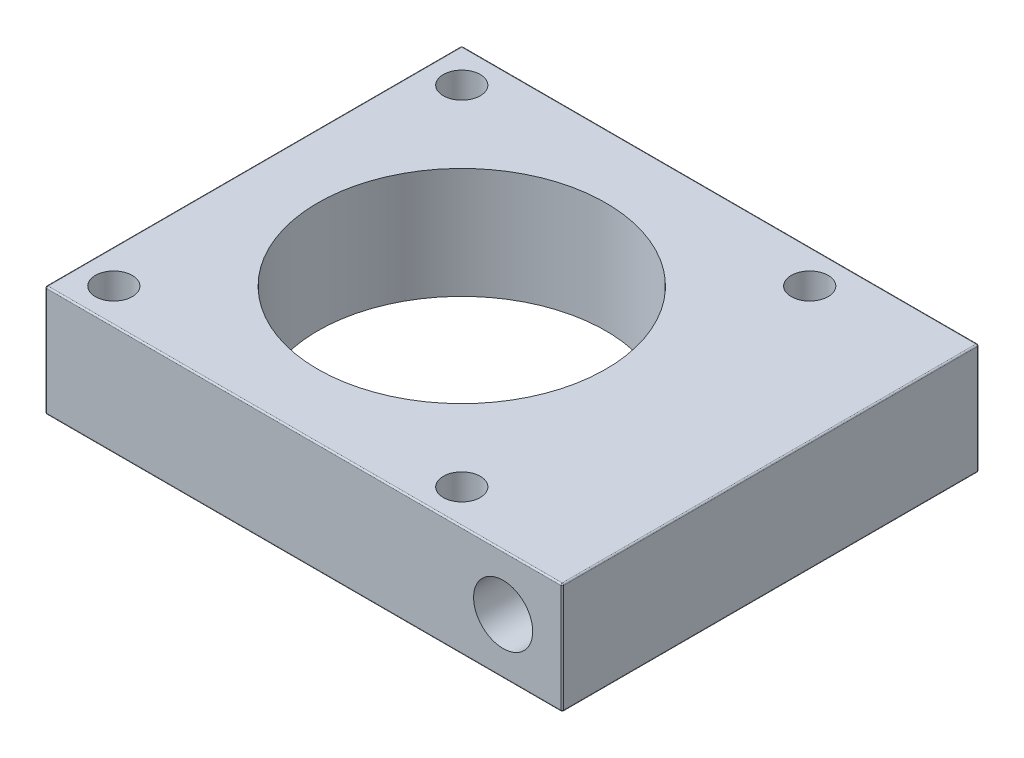
ISO-10303-21;
HEADER;
FILE_DESCRIPTION(('STEP AP214'),'2;1');
FILE_NAME('part.step','',(''),(''),'','','');
FILE_SCHEMA(('AUTOMOTIVE_DESIGN { 1 0 10303 214 1 1 1 1 }'));
ENDSEC;
DATA;
#1=APPLICATION_CONTEXT('core data for automotive mechanical design processes');
#2=APPLICATION_PROTOCOL_DEFINITION('international standard','automotive_design',2000,#1);
#3=PRODUCT_CONTEXT('',#1,'mechanical');
#4=PRODUCT('Part','Part','',(#3));
#5=PRODUCT_RELATED_PRODUCT_CATEGORY('part','',(#4));
#6=PRODUCT_DEFINITION_FORMATION('','',#4);
#7=PRODUCT_DEFINITION_CONTEXT('part definition',#1,'design');
#8=PRODUCT_DEFINITION('design','',#6,#7);
#9=PRODUCT_DEFINITION_SHAPE('','',#8);
#10=(LENGTH_UNIT() NAMED_UNIT(*) SI_UNIT(.MILLI.,.METRE.));
#11=(NAMED_UNIT(*) PLANE_ANGLE_UNIT() SI_UNIT($,.RADIAN.));
#12=(NAMED_UNIT(*) SI_UNIT($,.STERADIAN.) SOLID_ANGLE_UNIT());
#13=UNCERTAINTY_MEASURE_WITH_UNIT(LENGTH_MEASURE(1.E-05),#10,'distance_accuracy_value','');
#14=(GEOMETRIC_REPRESENTATION_CONTEXT(3) GLOBAL_UNCERTAINTY_ASSIGNED_CONTEXT((#13)) GLOBAL_UNIT_ASSIGNED_CONTEXT((#10,
#11,#12)) REPRESENTATION_CONTEXT('',''));
#15=CARTESIAN_POINT('',(0.,0.,0.));
#16=DIRECTION('',(0.,0.,1.));
#17=DIRECTION('',(1.,0.,0.));
#18=AXIS2_PLACEMENT_3D('',#15,#16,#17);
#19=CARTESIAN_POINT('',(0.,0.,56.4));
#20=DIRECTION('',(0.,0.,-1.));
#21=DIRECTION('',(-1.,0.,0.));
#22=AXIS2_PLACEMENT_3D('',#19,#20,#21);
#23=PLANE('',#22);
#24=DIRECTION('',(0.,-1.,0.));
#25=VECTOR('',#24,1.);
#26=CARTESIAN_POINT('',(0.2,0.,56.4));
#27=LINE('',#26,#25);
#28=CARTESIAN_POINT('',(0.2,14.8,56.4));
#29=VERTEX_POINT('',#28);
#30=CARTESIAN_POINT('',(0.2,0.2,56.4));
#31=VERTEX_POINT('',#30);
#32=EDGE_CURVE('E146',#29,#31,#27,.T.);
#33=ORIENTED_EDGE('',*,*,#32,.T.);
#34=DIRECTION('',(1.,0.,0.));
#35=VECTOR('',#34,1.);
#36=CARTESIAN_POINT('',(0.,0.2,56.4));
#37=LINE('',#36,#35);
#38=CARTESIAN_POINT('',(69.8,0.2,56.4));
#39=VERTEX_POINT('',#38);
#40=EDGE_CURVE('E151',#31,#39,#37,.T.);
#41=ORIENTED_EDGE('',*,*,#40,.T.);
#42=DIRECTION('',(0.,1.,0.));
#43=VECTOR('',#42,1.);
#44=CARTESIAN_POINT('',(69.8,0.,56.4));
#45=LINE('',#44,#43);
#46=CARTESIAN_POINT('',(69.8,14.8,56.4));
#47=VERTEX_POINT('',#46);
#48=EDGE_CURVE('E127',#39,#47,#45,.T.);
#49=ORIENTED_EDGE('',*,*,#48,.T.);
#50=DIRECTION('',(-1.,0.,0.));
#51=VECTOR('',#50,1.);
#52=CARTESIAN_POINT('',(0.,14.8,56.4));
#53=LINE('',#52,#51);
#54=EDGE_CURVE('E141',#47,#29,#53,.T.);
#55=ORIENTED_EDGE('',*,*,#54,.T.);
#56=EDGE_LOOP('',(#33,#41,#49,#55));
#57=FACE_BOUND('',#56,.T.);
#58=CARTESIAN_POINT('',(62.,7.5,56.4));
#59=DIRECTION('',(0.,0.,1.));
#60=DIRECTION('',(1.,0.,0.));
#61=AXIS2_PLACEMENT_3D('',#58,#59,#60);
#62=CIRCLE('',#61,4.00000000000001);
#63=CARTESIAN_POINT('',(66.,7.5,56.4));
#64=VERTEX_POINT('',#63);
#65=EDGE_CURVE('E147',#64,#64,#62,.T.);
#66=ORIENTED_EDGE('',*,*,#65,.F.);
#67=EDGE_LOOP('',(#66));
#68=FACE_BOUND('',#67,.T.);
#69=ADVANCED_FACE('F33',(#57,#68),#23,.F.);
#70=CARTESIAN_POINT('',(0.,0.,0.));
#71=DIRECTION('',(0.,0.,-1.));
#72=DIRECTION('',(-1.,0.,0.));
#73=AXIS2_PLACEMENT_3D('',#70,#71,#72);
#74=PLANE('',#73);
#75=DIRECTION('',(0.,1.,0.));
#76=VECTOR('',#75,1.);
#77=CARTESIAN_POINT('',(69.8,0.,0.));
#78=LINE('',#77,#76);
#79=CARTESIAN_POINT('',(69.8,14.8,0.));
#80=VERTEX_POINT('',#79);
#81=CARTESIAN_POINT('',(69.8,0.2,0.));
#82=VERTEX_POINT('',#81);
#83=EDGE_CURVE('E168',#80,#82,#78,.F.);
#84=ORIENTED_EDGE('',*,*,#83,.T.);
#85=DIRECTION('',(1.,0.,0.));
#86=VECTOR('',#85,1.);
#87=CARTESIAN_POINT('',(0.,0.2,0.));
#88=LINE('',#87,#86);
#89=CARTESIAN_POINT('',(0.2,0.2,0.));
#90=VERTEX_POINT('',#89);
#91=EDGE_CURVE('E171',#82,#90,#88,.F.);
#92=ORIENTED_EDGE('',*,*,#91,.T.);
#93=DIRECTION('',(0.,-1.,0.));
#94=VECTOR('',#93,1.);
#95=CARTESIAN_POINT('',(0.2,15.,0.));
#96=LINE('',#95,#94);
#97=CARTESIAN_POINT('',(0.2,14.8,0.));
#98=VERTEX_POINT('',#97);
#99=EDGE_CURVE('E166',#90,#98,#96,.F.);
#100=ORIENTED_EDGE('',*,*,#99,.T.);
#101=DIRECTION('',(-1.,0.,0.));
#102=VECTOR('',#101,1.);
#103=CARTESIAN_POINT('',(70.,14.8,0.));
#104=LINE('',#103,#102);
#105=EDGE_CURVE('E164',#98,#80,#104,.F.);
#106=ORIENTED_EDGE('',*,*,#105,.T.);
#107=EDGE_LOOP('',(#84,#92,#100,#106));
#108=FACE_BOUND('',#107,.T.);
#109=CARTESIAN_POINT('',(62.,7.5,0.));
#110=DIRECTION('',(0.,0.,1.));
#111=DIRECTION('',(1.,0.,0.));
#112=AXIS2_PLACEMENT_3D('',#109,#110,#111);
#113=CIRCLE('',#112,4.00000000000001);
#114=CARTESIAN_POINT('',(66.,7.5,0.));
#115=VERTEX_POINT('',#114);
#116=EDGE_CURVE('E282',#115,#115,#113,.T.);
#117=ORIENTED_EDGE('',*,*,#116,.T.);
#118=EDGE_LOOP('',(#117));
#119=FACE_BOUND('',#118,.T.);
#120=ADVANCED_FACE('F288',(#108,#119),#74,.T.);
#121=CARTESIAN_POINT('',(0.,0.,56.4));
#122=DIRECTION('',(1.,0.,0.));
#123=DIRECTION('',(0.,0.,-1.));
#124=AXIS2_PLACEMENT_3D('',#121,#122,#123);
#125=PLANE('',#124);
#126=DIRECTION('',(0.,0.,-1.));
#127=VECTOR('',#126,1.);
#128=CARTESIAN_POINT('',(0.,14.8,56.4));
#129=LINE('',#128,#127);
#130=CARTESIAN_POINT('',(0.,14.8,56.2));
#131=VERTEX_POINT('',#130);
#132=CARTESIAN_POINT('',(0.,14.8,0.199999999999999));
#133=VERTEX_POINT('',#132);
#134=EDGE_CURVE('E175',#131,#133,#129,.T.);
#135=ORIENTED_EDGE('',*,*,#134,.T.);
#136=DIRECTION('',(0.,-1.,0.));
#137=VECTOR('',#136,1.);
#138=CARTESIAN_POINT('',(0.,0.,0.199999999999999));
#139=LINE('',#138,#137);
#140=CARTESIAN_POINT('',(0.,0.2,0.199999999999999));
#141=VERTEX_POINT('',#140);
#142=EDGE_CURVE('E179',#133,#141,#139,.T.);
#143=ORIENTED_EDGE('',*,*,#142,.T.);
#144=DIRECTION('',(0.,0.,-1.));
#145=VECTOR('',#144,1.);
#146=CARTESIAN_POINT('',(0.,0.2,56.4));
#147=LINE('',#146,#145);
#148=CARTESIAN_POINT('',(0.,0.2,56.2));
#149=VERTEX_POINT('',#148);
#150=EDGE_CURVE('E177',#141,#149,#147,.F.);
#151=ORIENTED_EDGE('',*,*,#150,.T.);
#152=DIRECTION('',(0.,-1.,0.));
#153=VECTOR('',#152,1.);
#154=CARTESIAN_POINT('',(0.,0.,56.2));
#155=LINE('',#154,#153);
#156=EDGE_CURVE('E173',#149,#131,#155,.F.);
#157=ORIENTED_EDGE('',*,*,#156,.T.);
#158=EDGE_LOOP('',(#135,#143,#151,#157));
#159=FACE_BOUND('',#158,.T.);
#160=ADVANCED_FACE('F312',(#159),#125,.F.);
#161=CARTESIAN_POINT('',(0.,0.,56.4));
#162=DIRECTION('',(0.,1.,0.));
#163=DIRECTION('',(0.,0.,1.));
#164=AXIS2_PLACEMENT_3D('',#161,#162,#163);
#165=PLANE('',#164);
#166=DIRECTION('',(1.,0.,0.));
#167=VECTOR('',#166,1.);
#168=CARTESIAN_POINT('',(0.,0.,56.2));
#169=LINE('',#168,#167);
#170=CARTESIAN_POINT('',(69.8,0.,56.2));
#171=VERTEX_POINT('',#170);
#172=CARTESIAN_POINT('',(0.2,0.,56.2));
#173=VERTEX_POINT('',#172);
#174=EDGE_CURVE('E186',#171,#173,#169,.F.);
#175=ORIENTED_EDGE('',*,*,#174,.T.);
#176=DIRECTION('',(0.,0.,-1.));
#177=VECTOR('',#176,1.);
#178=CARTESIAN_POINT('',(0.2,0.,56.4));
#179=LINE('',#178,#177);
#180=CARTESIAN_POINT('',(0.2,0.,0.199999999999999));
#181=VERTEX_POINT('',#180);
#182=EDGE_CURVE('E188',#173,#181,#179,.T.);
#183=ORIENTED_EDGE('',*,*,#182,.T.);
#184=DIRECTION('',(1.,0.,0.));
#185=VECTOR('',#184,1.);
#186=CARTESIAN_POINT('',(70.,0.,0.199999999999999));
#187=LINE('',#186,#185);
#188=CARTESIAN_POINT('',(69.8,0.,0.199999999999999));
#189=VERTEX_POINT('',#188);
#190=EDGE_CURVE('E182',#181,#189,#187,.T.);
#191=ORIENTED_EDGE('',*,*,#190,.T.);
#192=DIRECTION('',(0.,0.,-1.));
#193=VECTOR('',#192,1.);
#194=CARTESIAN_POINT('',(69.8,0.,56.4));
#195=LINE('',#194,#193);
#196=EDGE_CURVE('E184',#189,#171,#195,.F.);
#197=ORIENTED_EDGE('',*,*,#196,.T.);
#198=EDGE_LOOP('',(#175,#183,#191,#197));
#199=FACE_BOUND('',#198,.T.);
#200=CARTESIAN_POINT('',(4.65,0.,4.65));
#201=DIRECTION('',(0.,-1.,0.));
#202=DIRECTION('',(0.,0.,-1.));
#203=AXIS2_PLACEMENT_3D('',#200,#201,#202);
#204=CIRCLE('',#203,2.5);
#205=CARTESIAN_POINT('',(4.65,0.,2.15));
#206=VERTEX_POINT('',#205);
#207=EDGE_CURVE('E260',#206,#206,#204,.T.);
#208=ORIENTED_EDGE('',*,*,#207,.F.);
#209=EDGE_LOOP('',(#208));
#210=FACE_BOUND('',#209,.T.);
#211=CARTESIAN_POINT('',(4.64999999999999,0.,51.75));
#212=DIRECTION('',(0.,-1.,0.));
#213=DIRECTION('',(0.,0.,-1.));
#214=AXIS2_PLACEMENT_3D('',#211,#212,#213);
#215=CIRCLE('',#214,2.5);
#216=CARTESIAN_POINT('',(4.64999999999999,0.,49.25));
#217=VERTEX_POINT('',#216);
#218=EDGE_CURVE('E431',#217,#217,#215,.T.);
#219=ORIENTED_EDGE('',*,*,#218,.F.);
#220=EDGE_LOOP('',(#219));
#221=FACE_BOUND('',#220,.T.);
#222=CARTESIAN_POINT('',(51.75,0.,51.75));
#223=DIRECTION('',(0.,-1.,0.));
#224=DIRECTION('',(0.,0.,-1.));
#225=AXIS2_PLACEMENT_3D('',#222,#223,#224);
#226=CIRCLE('',#225,2.5);
#227=CARTESIAN_POINT('',(51.75,0.,49.25));
#228=VERTEX_POINT('',#227);
#229=EDGE_CURVE('E276',#228,#228,#226,.T.);
#230=ORIENTED_EDGE('',*,*,#229,.F.);
#231=EDGE_LOOP('',(#230));
#232=FACE_BOUND('',#231,.T.);
#233=CARTESIAN_POINT('',(51.75,0.,4.65));
#234=DIRECTION('',(0.,-1.,0.));
#235=DIRECTION('',(0.,0.,-1.));
#236=AXIS2_PLACEMENT_3D('',#233,#234,#235);
#237=CIRCLE('',#236,2.5);
#238=CARTESIAN_POINT('',(51.75,0.,2.15));
#239=VERTEX_POINT('',#238);
#240=EDGE_CURVE('E273',#239,#239,#237,.T.);
#241=ORIENTED_EDGE('',*,*,#240,.F.);
#242=EDGE_LOOP('',(#241));
#243=FACE_BOUND('',#242,.T.);
#244=CARTESIAN_POINT('',(28.2,0.,28.2));
#245=DIRECTION('',(0.,1.,0.));
#246=DIRECTION('',(0.,0.,1.));
#247=AXIS2_PLACEMENT_3D('',#244,#245,#246);
#248=CIRCLE('',#247,19.5);
#249=CARTESIAN_POINT('',(28.2,0.,47.7));
#250=VERTEX_POINT('',#249);
#251=EDGE_CURVE('E279',#250,#250,#248,.T.);
#252=ORIENTED_EDGE('',*,*,#251,.T.);
#253=EDGE_LOOP('',(#252));
#254=FACE_BOUND('',#253,.T.);
#255=ADVANCED_FACE('F318',(#199,#210,#221,#232,#243,#254),#165,.F.);
#256=CARTESIAN_POINT('',(70.,0.,56.4));
#257=DIRECTION('',(-1.,0.,0.));
#258=DIRECTION('',(0.,0.,1.));
#259=AXIS2_PLACEMENT_3D('',#256,#257,#258);
#260=PLANE('',#259);
#261=DIRECTION('',(0.,1.,0.));
#262=VECTOR('',#261,1.);
#263=CARTESIAN_POINT('',(70.,15.,0.199999999999999));
#264=LINE('',#263,#262);
#265=CARTESIAN_POINT('',(70.,0.2,0.199999999999999));
#266=VERTEX_POINT('',#265);
#267=CARTESIAN_POINT('',(70.,14.8,0.199999999999999));
#268=VERTEX_POINT('',#267);
#269=EDGE_CURVE('E159',#266,#268,#264,.T.);
#270=ORIENTED_EDGE('',*,*,#269,.T.);
#271=DIRECTION('',(0.,0.,-1.));
#272=VECTOR('',#271,1.);
#273=CARTESIAN_POINT('',(70.,14.8,56.4));
#274=LINE('',#273,#272);
#275=CARTESIAN_POINT('',(70.,14.8,56.2));
#276=VERTEX_POINT('',#275);
#277=EDGE_CURVE('E162',#268,#276,#274,.F.);
#278=ORIENTED_EDGE('',*,*,#277,.T.);
#279=DIRECTION('',(0.,1.,0.));
#280=VECTOR('',#279,1.);
#281=CARTESIAN_POINT('',(70.,0.,56.2));
#282=LINE('',#281,#280);
#283=CARTESIAN_POINT('',(70.,0.2,56.2));
#284=VERTEX_POINT('',#283);
#285=EDGE_CURVE('E129',#276,#284,#282,.F.);
#286=ORIENTED_EDGE('',*,*,#285,.T.);
#287=DIRECTION('',(0.,0.,-1.));
#288=VECTOR('',#287,1.);
#289=CARTESIAN_POINT('',(70.,0.2,56.4));
#290=LINE('',#289,#288);
#291=EDGE_CURVE('E154',#284,#266,#290,.T.);
#292=ORIENTED_EDGE('',*,*,#291,.T.);
#293=EDGE_LOOP('',(#270,#278,#286,#292));
#294=FACE_BOUND('',#293,.T.);
#295=ADVANCED_FACE('F304',(#294),#260,.F.);
#296=CARTESIAN_POINT('',(0.,15.,56.4));
#297=DIRECTION('',(0.,-1.,0.));
#298=DIRECTION('',(0.,0.,-1.));
#299=AXIS2_PLACEMENT_3D('',#296,#297,#298);
#300=PLANE('',#299);
#301=DIRECTION('',(-1.,0.,0.));
#302=VECTOR('',#301,1.);
#303=CARTESIAN_POINT('',(0.,15.,0.199999999999999));
#304=LINE('',#303,#302);
#305=CARTESIAN_POINT('',(69.8,15.,0.199999999999999));
#306=VERTEX_POINT('',#305);
#307=CARTESIAN_POINT('',(0.2,15.,0.199999999999999));
#308=VERTEX_POINT('',#307);
#309=EDGE_CURVE('E191',#306,#308,#304,.T.);
#310=ORIENTED_EDGE('',*,*,#309,.T.);
#311=DIRECTION('',(0.,0.,-1.));
#312=VECTOR('',#311,1.);
#313=CARTESIAN_POINT('',(0.2,15.,56.4));
#314=LINE('',#313,#312);
#315=CARTESIAN_POINT('',(0.2,15.,56.2));
#316=VERTEX_POINT('',#315);
#317=EDGE_CURVE('E11',#308,#316,#314,.F.);
#318=ORIENTED_EDGE('',*,*,#317,.T.);
#319=DIRECTION('',(-1.,0.,0.));
#320=VECTOR('',#319,1.);
#321=CARTESIAN_POINT('',(0.,15.,56.2));
#322=LINE('',#321,#320);
#323=CARTESIAN_POINT('',(69.8,15.,56.2));
#324=VERTEX_POINT('',#323);
#325=EDGE_CURVE('E42',#316,#324,#322,.F.);
#326=ORIENTED_EDGE('',*,*,#325,.T.);
#327=DIRECTION('',(0.,0.,-1.));
#328=VECTOR('',#327,1.);
#329=CARTESIAN_POINT('',(69.8,15.,56.4));
#330=LINE('',#329,#328);
#331=EDGE_CURVE('E193',#324,#306,#330,.T.);
#332=ORIENTED_EDGE('',*,*,#331,.T.);
#333=EDGE_LOOP('',(#310,#318,#326,#332));
#334=FACE_BOUND('',#333,.T.);
#335=CARTESIAN_POINT('',(4.65,15.,4.65));
#336=DIRECTION('',(0.,-1.,0.));
#337=DIRECTION('',(0.,0.,-1.));
#338=AXIS2_PLACEMENT_3D('',#335,#336,#337);
#339=CIRCLE('',#338,2.5);
#340=CARTESIAN_POINT('',(4.65,15.,2.15));
#341=VERTEX_POINT('',#340);
#342=EDGE_CURVE('E254',#341,#341,#339,.T.);
#343=ORIENTED_EDGE('',*,*,#342,.T.);
#344=EDGE_LOOP('',(#343));
#345=FACE_BOUND('',#344,.T.);
#346=CARTESIAN_POINT('',(4.64999999999999,15.,51.75));
#347=DIRECTION('',(0.,-1.,0.));
#348=DIRECTION('',(0.,0.,-1.));
#349=AXIS2_PLACEMENT_3D('',#346,#347,#348);
#350=CIRCLE('',#349,2.5);
#351=CARTESIAN_POINT('',(4.64999999999999,15.,49.25));
#352=VERTEX_POINT('',#351);
#353=EDGE_CURVE('E265',#352,#352,#350,.T.);
#354=ORIENTED_EDGE('',*,*,#353,.T.);
#355=EDGE_LOOP('',(#354));
#356=FACE_BOUND('',#355,.T.);
#357=CARTESIAN_POINT('',(51.75,15.,51.75));
#358=DIRECTION('',(0.,-1.,0.));
#359=DIRECTION('',(0.,0.,-1.));
#360=AXIS2_PLACEMENT_3D('',#357,#358,#359);
#361=CIRCLE('',#360,2.5);
#362=CARTESIAN_POINT('',(51.75,15.,49.25));
#363=VERTEX_POINT('',#362);
#364=EDGE_CURVE('E462',#363,#363,#361,.T.);
#365=ORIENTED_EDGE('',*,*,#364,.T.);
#366=EDGE_LOOP('',(#365));
#367=FACE_BOUND('',#366,.T.);
#368=CARTESIAN_POINT('',(51.75,15.,4.65));
#369=DIRECTION('',(0.,-1.,0.));
#370=DIRECTION('',(0.,0.,-1.));
#371=AXIS2_PLACEMENT_3D('',#368,#369,#370);
#372=CIRCLE('',#371,2.5);
#373=CARTESIAN_POINT('',(51.75,15.,2.15));
#374=VERTEX_POINT('',#373);
#375=EDGE_CURVE('E269',#374,#374,#372,.T.);
#376=ORIENTED_EDGE('',*,*,#375,.T.);
#377=EDGE_LOOP('',(#376));
#378=FACE_BOUND('',#377,.T.);
#379=CARTESIAN_POINT('',(28.2,15.,28.2));
#380=DIRECTION('',(0.,1.,0.));
#381=DIRECTION('',(0.,0.,1.));
#382=AXIS2_PLACEMENT_3D('',#379,#380,#381);
#383=CIRCLE('',#382,19.5);
#384=CARTESIAN_POINT('',(28.2,15.,47.7));
#385=VERTEX_POINT('',#384);
#386=EDGE_CURVE('E272',#385,#385,#383,.T.);
#387=ORIENTED_EDGE('',*,*,#386,.F.);
#388=EDGE_LOOP('',(#387));
#389=FACE_BOUND('',#388,.T.);
#390=ADVANCED_FACE('F293',(#334,#345,#356,#367,#378,#389),#300,.F.);
#391=CARTESIAN_POINT('',(62.,7.5,56.4));
#392=DIRECTION('',(0.,0.,-1.));
#393=DIRECTION('',(-1.,0.,0.));
#394=AXIS2_PLACEMENT_3D('',#391,#392,#393);
#395=CYLINDRICAL_SURFACE('',#394,4.00000000000001);
#396=ORIENTED_EDGE('',*,*,#65,.T.);
#397=EDGE_LOOP('',(#396));
#398=FACE_BOUND('',#397,.T.);
#399=ORIENTED_EDGE('',*,*,#116,.F.);
#400=EDGE_LOOP('',(#399));
#401=FACE_BOUND('',#400,.T.);
#402=ADVANCED_FACE('F290',(#398,#401),#395,.F.);
#403=CARTESIAN_POINT('',(28.2,-27.3,28.2));
#404=DIRECTION('',(0.,1.,0.));
#405=DIRECTION('',(0.,0.,1.));
#406=AXIS2_PLACEMENT_3D('',#403,#404,#405);
#407=CYLINDRICAL_SURFACE('',#406,19.5);
#408=ORIENTED_EDGE('',*,*,#386,.T.);
#409=EDGE_LOOP('',(#408));
#410=FACE_BOUND('',#409,.T.);
#411=ORIENTED_EDGE('',*,*,#251,.F.);
#412=EDGE_LOOP('',(#411));
#413=FACE_BOUND('',#412,.T.);
#414=ADVANCED_FACE('F292',(#410,#413),#407,.F.);
#415=CARTESIAN_POINT('',(51.75,15.,4.65));
#416=DIRECTION('',(0.,-1.,0.));
#417=DIRECTION('',(0.,0.,-1.));
#418=AXIS2_PLACEMENT_3D('',#415,#416,#417);
#419=CYLINDRICAL_SURFACE('',#418,2.5);
#420=ORIENTED_EDGE('',*,*,#375,.F.);
#421=EDGE_LOOP('',(#420));
#422=FACE_BOUND('',#421,.T.);
#423=ORIENTED_EDGE('',*,*,#240,.T.);
#424=EDGE_LOOP('',(#423));
#425=FACE_BOUND('',#424,.T.);
#426=ADVANCED_FACE('F300',(#422,#425),#419,.F.);
#427=CARTESIAN_POINT('',(51.75,15.,51.75));
#428=DIRECTION('',(0.,-1.,0.));
#429=DIRECTION('',(0.,0.,-1.));
#430=AXIS2_PLACEMENT_3D('',#427,#428,#429);
#431=CYLINDRICAL_SURFACE('',#430,2.5);
#432=ORIENTED_EDGE('',*,*,#364,.F.);
#433=EDGE_LOOP('',(#432));
#434=FACE_BOUND('',#433,.T.);
#435=ORIENTED_EDGE('',*,*,#229,.T.);
#436=EDGE_LOOP('',(#435));
#437=FACE_BOUND('',#436,.T.);
#438=ADVANCED_FACE('F441',(#434,#437),#431,.F.);
#439=CARTESIAN_POINT('',(4.64999999999999,15.,51.75));
#440=DIRECTION('',(0.,-1.,0.));
#441=DIRECTION('',(0.,0.,-1.));
#442=AXIS2_PLACEMENT_3D('',#439,#440,#441);
#443=CYLINDRICAL_SURFACE('',#442,2.5);
#444=ORIENTED_EDGE('',*,*,#353,.F.);
#445=EDGE_LOOP('',(#444));
#446=FACE_BOUND('',#445,.T.);
#447=ORIENTED_EDGE('',*,*,#218,.T.);
#448=EDGE_LOOP('',(#447));
#449=FACE_BOUND('',#448,.T.);
#450=ADVANCED_FACE('F447',(#446,#449),#443,.F.);
#451=CARTESIAN_POINT('',(4.65,15.,4.65));
#452=DIRECTION('',(0.,-1.,0.));
#453=DIRECTION('',(0.,0.,-1.));
#454=AXIS2_PLACEMENT_3D('',#451,#452,#453);
#455=CYLINDRICAL_SURFACE('',#454,2.5);
#456=ORIENTED_EDGE('',*,*,#342,.F.);
#457=EDGE_LOOP('',(#456));
#458=FACE_BOUND('',#457,.T.);
#459=ORIENTED_EDGE('',*,*,#207,.T.);
#460=EDGE_LOOP('',(#459));
#461=FACE_BOUND('',#460,.T.);
#462=ADVANCED_FACE('F395',(#458,#461),#455,.F.);
#463=CARTESIAN_POINT('',(0.2,0.,0.199999999999999));
#464=DIRECTION('',(0.,1.,0.));
#465=DIRECTION('',(0.,0.,1.));
#466=AXIS2_PLACEMENT_3D('',#463,#464,#465);
#467=CYLINDRICAL_SURFACE('',#466,0.2);
#468=CARTESIAN_POINT('',(0.2,0.2,0.199999999999999));
#469=DIRECTION('',(0.,-1.,0.));
#470=DIRECTION('',(0.,0.,-1.));
#471=AXIS2_PLACEMENT_3D('',#468,#469,#470);
#472=CIRCLE('',#471,0.2);
#473=EDGE_CURVE('E37',#141,#90,#472,.T.);
#474=ORIENTED_EDGE('',*,*,#473,.F.);
#475=ORIENTED_EDGE('',*,*,#142,.F.);
#476=CARTESIAN_POINT('',(0.2,14.8,0.2));
#477=DIRECTION('',(0.,1.,0.));
#478=DIRECTION('',(0.,0.,1.));
#479=AXIS2_PLACEMENT_3D('',#476,#477,#478);
#480=CIRCLE('',#479,0.2);
#481=EDGE_CURVE('E247',#98,#133,#480,.T.);
#482=ORIENTED_EDGE('',*,*,#481,.F.);
#483=ORIENTED_EDGE('',*,*,#99,.F.);
#484=EDGE_LOOP('',(#474,#475,#482,#483));
#485=FACE_BOUND('',#484,.T.);
#486=ADVANCED_FACE('F35',(#485),#467,.T.);
#487=CARTESIAN_POINT('',(0.2,0.2,0.2));
#488=DIRECTION('',(0.,0.,1.));
#489=DIRECTION('',(1.,0.,0.));
#490=AXIS2_PLACEMENT_3D('',#487,#488,#489);
#491=SPHERICAL_SURFACE('',#490,0.2);
#492=CARTESIAN_POINT('',(0.2,0.2,0.199999999999999));
#493=DIRECTION('',(0.,0.,-1.));
#494=DIRECTION('',(-1.,0.,0.));
#495=AXIS2_PLACEMENT_3D('',#492,#493,#494);
#496=CIRCLE('',#495,0.2);
#497=EDGE_CURVE('E242',#141,#181,#496,.F.);
#498=ORIENTED_EDGE('',*,*,#497,.F.);
#499=ORIENTED_EDGE('',*,*,#473,.T.);
#500=CARTESIAN_POINT('',(0.2,0.2,0.2));
#501=DIRECTION('',(-1.,0.,0.));
#502=DIRECTION('',(0.,0.,1.));
#503=AXIS2_PLACEMENT_3D('',#500,#501,#502);
#504=CIRCLE('',#503,0.2);
#505=EDGE_CURVE('E245',#181,#90,#504,.F.);
#506=ORIENTED_EDGE('',*,*,#505,.F.);
#507=EDGE_LOOP('',(#498,#499,#506));
#508=FACE_BOUND('',#507,.T.);
#509=ADVANCED_FACE('F390',(#508),#491,.T.);
#510=CARTESIAN_POINT('',(0.2,14.8,0.2));
#511=DIRECTION('',(0.,0.,1.));
#512=DIRECTION('',(1.,0.,0.));
#513=AXIS2_PLACEMENT_3D('',#510,#511,#512);
#514=SPHERICAL_SURFACE('',#513,0.2);
#515=CARTESIAN_POINT('',(0.2,14.8,0.199999999999999));
#516=DIRECTION('',(-1.,0.,0.));
#517=DIRECTION('',(0.,0.,1.));
#518=AXIS2_PLACEMENT_3D('',#515,#516,#517);
#519=CIRCLE('',#518,0.2);
#520=EDGE_CURVE('E236',#98,#308,#519,.F.);
#521=ORIENTED_EDGE('',*,*,#520,.F.);
#522=ORIENTED_EDGE('',*,*,#481,.T.);
#523=CARTESIAN_POINT('',(0.2,14.8,0.199999999999999));
#524=DIRECTION('',(0.,0.,-1.));
#525=DIRECTION('',(-1.,0.,0.));
#526=AXIS2_PLACEMENT_3D('',#523,#524,#525);
#527=CIRCLE('',#526,0.2);
#528=EDGE_CURVE('E239',#308,#133,#527,.F.);
#529=ORIENTED_EDGE('',*,*,#528,.F.);
#530=EDGE_LOOP('',(#521,#522,#529));
#531=FACE_BOUND('',#530,.T.);
#532=ADVANCED_FACE('F387',(#531),#514,.T.);
#533=CARTESIAN_POINT('',(0.,0.2,0.199999999999999));
#534=DIRECTION('',(-1.,0.,0.));
#535=DIRECTION('',(0.,0.,1.));
#536=AXIS2_PLACEMENT_3D('',#533,#534,#535);
#537=CYLINDRICAL_SURFACE('',#536,0.2);
#538=ORIENTED_EDGE('',*,*,#505,.T.);
#539=ORIENTED_EDGE('',*,*,#91,.F.);
#540=CARTESIAN_POINT('',(69.8,0.2,0.199999999999999));
#541=DIRECTION('',(1.,0.,0.));
#542=DIRECTION('',(0.,0.,-1.));
#543=AXIS2_PLACEMENT_3D('',#540,#541,#542);
#544=CIRCLE('',#543,0.2);
#545=EDGE_CURVE('E231',#189,#82,#544,.T.);
#546=ORIENTED_EDGE('',*,*,#545,.F.);
#547=ORIENTED_EDGE('',*,*,#190,.F.);
#548=EDGE_LOOP('',(#538,#539,#546,#547));
#549=FACE_BOUND('',#548,.T.);
#550=ADVANCED_FACE('F383',(#549),#537,.T.);
#551=CARTESIAN_POINT('',(0.2,0.2,56.4));
#552=DIRECTION('',(0.,0.,-1.));
#553=DIRECTION('',(-1.,0.,0.));
#554=AXIS2_PLACEMENT_3D('',#551,#552,#553);
#555=CYLINDRICAL_SURFACE('',#554,0.2);
#556=ORIENTED_EDGE('',*,*,#497,.T.);
#557=ORIENTED_EDGE('',*,*,#182,.F.);
#558=CARTESIAN_POINT('',(0.2,0.2,56.2));
#559=DIRECTION('',(0.,0.,1.));
#560=DIRECTION('',(1.,0.,0.));
#561=AXIS2_PLACEMENT_3D('',#558,#559,#560);
#562=CIRCLE('',#561,0.2);
#563=EDGE_CURVE('E228',#149,#173,#562,.T.);
#564=ORIENTED_EDGE('',*,*,#563,.F.);
#565=ORIENTED_EDGE('',*,*,#150,.F.);
#566=EDGE_LOOP('',(#556,#557,#564,#565));
#567=FACE_BOUND('',#566,.T.);
#568=ADVANCED_FACE('F379',(#567),#555,.T.);
#569=CARTESIAN_POINT('',(0.2,0.,56.2));
#570=DIRECTION('',(0.,-1.,0.));
#571=DIRECTION('',(0.,0.,-1.));
#572=AXIS2_PLACEMENT_3D('',#569,#570,#571);
#573=CYLINDRICAL_SURFACE('',#572,0.2);
#574=CARTESIAN_POINT('',(0.2,14.8,56.2));
#575=DIRECTION('',(0.,1.,0.));
#576=DIRECTION('',(0.,0.,1.));
#577=AXIS2_PLACEMENT_3D('',#574,#575,#576);
#578=CIRCLE('',#577,0.2);
#579=EDGE_CURVE('E222',#131,#29,#578,.T.);
#580=ORIENTED_EDGE('',*,*,#579,.F.);
#581=ORIENTED_EDGE('',*,*,#156,.F.);
#582=CARTESIAN_POINT('',(0.2,0.2,56.2));
#583=DIRECTION('',(0.,-1.,0.));
#584=DIRECTION('',(0.,0.,-1.));
#585=AXIS2_PLACEMENT_3D('',#582,#583,#584);
#586=CIRCLE('',#585,0.2);
#587=EDGE_CURVE('E225',#31,#149,#586,.T.);
#588=ORIENTED_EDGE('',*,*,#587,.F.);
#589=ORIENTED_EDGE('',*,*,#32,.F.);
#590=EDGE_LOOP('',(#580,#581,#588,#589));
#591=FACE_BOUND('',#590,.T.);
#592=ADVANCED_FACE('F375',(#591),#573,.T.);
#593=CARTESIAN_POINT('',(0.2,14.8,56.4));
#594=DIRECTION('',(0.,0.,-1.));
#595=DIRECTION('',(-1.,0.,0.));
#596=AXIS2_PLACEMENT_3D('',#593,#594,#595);
#597=CYLINDRICAL_SURFACE('',#596,0.2);
#598=ORIENTED_EDGE('',*,*,#528,.T.);
#599=ORIENTED_EDGE('',*,*,#134,.F.);
#600=CARTESIAN_POINT('',(0.2,14.8,56.2));
#601=DIRECTION('',(0.,0.,1.));
#602=DIRECTION('',(1.,0.,0.));
#603=AXIS2_PLACEMENT_3D('',#600,#601,#602);
#604=CIRCLE('',#603,0.2);
#605=EDGE_CURVE('E219',#316,#131,#604,.T.);
#606=ORIENTED_EDGE('',*,*,#605,.F.);
#607=ORIENTED_EDGE('',*,*,#317,.F.);
#608=EDGE_LOOP('',(#598,#599,#606,#607));
#609=FACE_BOUND('',#608,.T.);
#610=ADVANCED_FACE('F371',(#609),#597,.T.);
#611=CARTESIAN_POINT('',(0.,14.8,0.199999999999999));
#612=DIRECTION('',(1.,0.,0.));
#613=DIRECTION('',(0.,0.,-1.));
#614=AXIS2_PLACEMENT_3D('',#611,#612,#613);
#615=CYLINDRICAL_SURFACE('',#614,0.2);
#616=ORIENTED_EDGE('',*,*,#520,.T.);
#617=ORIENTED_EDGE('',*,*,#309,.F.);
#618=CARTESIAN_POINT('',(69.8,14.8,0.2));
#619=DIRECTION('',(1.,0.,0.));
#620=DIRECTION('',(0.,0.,-1.));
#621=AXIS2_PLACEMENT_3D('',#618,#619,#620);
#622=CIRCLE('',#621,0.2);
#623=EDGE_CURVE('E216',#80,#306,#622,.T.);
#624=ORIENTED_EDGE('',*,*,#623,.F.);
#625=ORIENTED_EDGE('',*,*,#105,.F.);
#626=EDGE_LOOP('',(#616,#617,#624,#625));
#627=FACE_BOUND('',#626,.T.);
#628=ADVANCED_FACE('F367',(#627),#615,.T.);
#629=CARTESIAN_POINT('',(69.8,0.,0.199999999999999));
#630=DIRECTION('',(0.,-1.,0.));
#631=DIRECTION('',(0.,0.,-1.));
#632=AXIS2_PLACEMENT_3D('',#629,#630,#631);
#633=CYLINDRICAL_SURFACE('',#632,0.2);
#634=CARTESIAN_POINT('',(69.8,0.2,0.2));
#635=DIRECTION('',(0.,-1.,0.));
#636=DIRECTION('',(0.,0.,-1.));
#637=AXIS2_PLACEMENT_3D('',#634,#635,#636);
#638=CIRCLE('',#637,0.2);
#639=EDGE_CURVE('E233',#82,#266,#638,.T.);
#640=ORIENTED_EDGE('',*,*,#639,.F.);
#641=ORIENTED_EDGE('',*,*,#83,.F.);
#642=CARTESIAN_POINT('',(69.8,14.8,0.199999999999999));
#643=DIRECTION('',(0.,1.,0.));
#644=DIRECTION('',(0.,0.,1.));
#645=AXIS2_PLACEMENT_3D('',#642,#643,#644);
#646=CIRCLE('',#645,0.2);
#647=EDGE_CURVE('E213',#268,#80,#646,.T.);
#648=ORIENTED_EDGE('',*,*,#647,.F.);
#649=ORIENTED_EDGE('',*,*,#269,.F.);
#650=EDGE_LOOP('',(#640,#641,#648,#649));
#651=FACE_BOUND('',#650,.T.);
#652=ADVANCED_FACE('F363',(#651),#633,.T.);
#653=CARTESIAN_POINT('',(69.8,0.2,0.2));
#654=DIRECTION('',(0.,0.,1.));
#655=DIRECTION('',(1.,0.,0.));
#656=AXIS2_PLACEMENT_3D('',#653,#654,#655);
#657=SPHERICAL_SURFACE('',#656,0.2);
#658=ORIENTED_EDGE('',*,*,#545,.T.);
#659=ORIENTED_EDGE('',*,*,#639,.T.);
#660=CARTESIAN_POINT('',(69.8,0.2,0.199999999999999));
#661=DIRECTION('',(0.,0.,-1.));
#662=DIRECTION('',(-1.,0.,0.));
#663=AXIS2_PLACEMENT_3D('',#660,#661,#662);
#664=CIRCLE('',#663,0.2);
#665=EDGE_CURVE('E210',#189,#266,#664,.F.);
#666=ORIENTED_EDGE('',*,*,#665,.F.);
#667=EDGE_LOOP('',(#658,#659,#666));
#668=FACE_BOUND('',#667,.T.);
#669=ADVANCED_FACE('F359',(#668),#657,.T.);
#670=CARTESIAN_POINT('',(0.2,0.2,56.2));
#671=DIRECTION('',(0.,0.,1.));
#672=DIRECTION('',(1.,0.,0.));
#673=AXIS2_PLACEMENT_3D('',#670,#671,#672);
#674=SPHERICAL_SURFACE('',#673,0.2);
#675=ORIENTED_EDGE('',*,*,#587,.T.);
#676=ORIENTED_EDGE('',*,*,#563,.T.);
#677=CARTESIAN_POINT('',(0.2,0.2,56.2));
#678=DIRECTION('',(-1.,0.,0.));
#679=DIRECTION('',(0.,0.,1.));
#680=AXIS2_PLACEMENT_3D('',#677,#678,#679);
#681=CIRCLE('',#680,0.2);
#682=EDGE_CURVE('E207',#31,#173,#681,.F.);
#683=ORIENTED_EDGE('',*,*,#682,.F.);
#684=EDGE_LOOP('',(#675,#676,#683));
#685=FACE_BOUND('',#684,.T.);
#686=ADVANCED_FACE('F355',(#685),#674,.T.);
#687=CARTESIAN_POINT('',(0.2,14.8,56.2));
#688=DIRECTION('',(0.,0.,1.));
#689=DIRECTION('',(1.,0.,0.));
#690=AXIS2_PLACEMENT_3D('',#687,#688,#689);
#691=SPHERICAL_SURFACE('',#690,0.2);
#692=ORIENTED_EDGE('',*,*,#605,.T.);
#693=ORIENTED_EDGE('',*,*,#579,.T.);
#694=CARTESIAN_POINT('',(0.2,14.8,56.2));
#695=DIRECTION('',(-1.,0.,0.));
#696=DIRECTION('',(0.,0.,1.));
#697=AXIS2_PLACEMENT_3D('',#694,#695,#696);
#698=CIRCLE('',#697,0.2);
#699=EDGE_CURVE('E143',#316,#29,#698,.F.);
#700=ORIENTED_EDGE('',*,*,#699,.F.);
#701=EDGE_LOOP('',(#692,#693,#700));
#702=FACE_BOUND('',#701,.T.);
#703=ADVANCED_FACE('F351',(#702),#691,.T.);
#704=CARTESIAN_POINT('',(69.8,14.8,0.2));
#705=DIRECTION('',(0.,0.,1.));
#706=DIRECTION('',(1.,0.,0.));
#707=AXIS2_PLACEMENT_3D('',#704,#705,#706);
#708=SPHERICAL_SURFACE('',#707,0.2);
#709=ORIENTED_EDGE('',*,*,#647,.T.);
#710=ORIENTED_EDGE('',*,*,#623,.T.);
#711=CARTESIAN_POINT('',(69.8,14.8,0.199999999999999));
#712=DIRECTION('',(0.,0.,-1.));
#713=DIRECTION('',(-1.,0.,0.));
#714=AXIS2_PLACEMENT_3D('',#711,#712,#713);
#715=CIRCLE('',#714,0.2);
#716=EDGE_CURVE('E203',#268,#306,#715,.F.);
#717=ORIENTED_EDGE('',*,*,#716,.F.);
#718=EDGE_LOOP('',(#709,#710,#717));
#719=FACE_BOUND('',#718,.T.);
#720=ADVANCED_FACE('F347',(#719),#708,.T.);
#721=CARTESIAN_POINT('',(69.8,0.2,56.4));
#722=DIRECTION('',(0.,0.,-1.));
#723=DIRECTION('',(-1.,0.,0.));
#724=AXIS2_PLACEMENT_3D('',#721,#722,#723);
#725=CYLINDRICAL_SURFACE('',#724,0.2);
#726=ORIENTED_EDGE('',*,*,#665,.T.);
#727=ORIENTED_EDGE('',*,*,#291,.F.);
#728=CARTESIAN_POINT('',(69.8,0.2,56.2));
#729=DIRECTION('',(0.,0.,1.));
#730=DIRECTION('',(1.,0.,0.));
#731=AXIS2_PLACEMENT_3D('',#728,#729,#730);
#732=CIRCLE('',#731,0.2);
#733=EDGE_CURVE('E200',#171,#284,#732,.T.);
#734=ORIENTED_EDGE('',*,*,#733,.F.);
#735=ORIENTED_EDGE('',*,*,#196,.F.);
#736=EDGE_LOOP('',(#726,#727,#734,#735));
#737=FACE_BOUND('',#736,.T.);
#738=ADVANCED_FACE('F343',(#737),#725,.T.);
#739=CARTESIAN_POINT('',(0.,0.2,56.2));
#740=DIRECTION('',(1.,0.,0.));
#741=DIRECTION('',(0.,0.,-1.));
#742=AXIS2_PLACEMENT_3D('',#739,#740,#741);
#743=CYLINDRICAL_SURFACE('',#742,0.2);
#744=ORIENTED_EDGE('',*,*,#682,.T.);
#745=ORIENTED_EDGE('',*,*,#174,.F.);
#746=CARTESIAN_POINT('',(69.8,0.2,56.2));
#747=DIRECTION('',(1.,0.,0.));
#748=DIRECTION('',(0.,0.,-1.));
#749=AXIS2_PLACEMENT_3D('',#746,#747,#748);
#750=CIRCLE('',#749,0.2);
#751=EDGE_CURVE('E139',#39,#171,#750,.T.);
#752=ORIENTED_EDGE('',*,*,#751,.F.);
#753=ORIENTED_EDGE('',*,*,#40,.F.);
#754=EDGE_LOOP('',(#744,#745,#752,#753));
#755=FACE_BOUND('',#754,.T.);
#756=ADVANCED_FACE('F340',(#755),#743,.T.);
#757=CARTESIAN_POINT('',(0.,14.8,56.2));
#758=DIRECTION('',(-1.,0.,0.));
#759=DIRECTION('',(0.,0.,1.));
#760=AXIS2_PLACEMENT_3D('',#757,#758,#759);
#761=CYLINDRICAL_SURFACE('',#760,0.2);
#762=ORIENTED_EDGE('',*,*,#699,.T.);
#763=ORIENTED_EDGE('',*,*,#54,.F.);
#764=CARTESIAN_POINT('',(69.8,14.8,56.2));
#765=DIRECTION('',(1.,0.,0.));
#766=DIRECTION('',(0.,0.,-1.));
#767=AXIS2_PLACEMENT_3D('',#764,#765,#766);
#768=CIRCLE('',#767,0.2);
#769=EDGE_CURVE('E134',#324,#47,#768,.T.);
#770=ORIENTED_EDGE('',*,*,#769,.F.);
#771=ORIENTED_EDGE('',*,*,#325,.F.);
#772=EDGE_LOOP('',(#762,#763,#770,#771));
#773=FACE_BOUND('',#772,.T.);
#774=ADVANCED_FACE('F142',(#773),#761,.T.);
#775=CARTESIAN_POINT('',(69.8,14.8,56.4));
#776=DIRECTION('',(0.,0.,-1.));
#777=DIRECTION('',(-1.,0.,0.));
#778=AXIS2_PLACEMENT_3D('',#775,#776,#777);
#779=CYLINDRICAL_SURFACE('',#778,0.2);
#780=ORIENTED_EDGE('',*,*,#716,.T.);
#781=ORIENTED_EDGE('',*,*,#331,.F.);
#782=CARTESIAN_POINT('',(69.8,14.8,56.2));
#783=DIRECTION('',(0.,0.,1.));
#784=DIRECTION('',(1.,0.,0.));
#785=AXIS2_PLACEMENT_3D('',#782,#783,#784);
#786=CIRCLE('',#785,0.2);
#787=EDGE_CURVE('E138',#276,#324,#786,.T.);
#788=ORIENTED_EDGE('',*,*,#787,.F.);
#789=ORIENTED_EDGE('',*,*,#277,.F.);
#790=EDGE_LOOP('',(#780,#781,#788,#789));
#791=FACE_BOUND('',#790,.T.);
#792=ADVANCED_FACE('F333',(#791),#779,.T.);
#793=CARTESIAN_POINT('',(69.8,0.2,56.2));
#794=DIRECTION('',(0.,0.,1.));
#795=DIRECTION('',(1.,0.,0.));
#796=AXIS2_PLACEMENT_3D('',#793,#794,#795);
#797=SPHERICAL_SURFACE('',#796,0.2);
#798=ORIENTED_EDGE('',*,*,#751,.T.);
#799=ORIENTED_EDGE('',*,*,#733,.T.);
#800=CARTESIAN_POINT('',(69.8,0.2,56.2));
#801=DIRECTION('',(0.,-1.,0.));
#802=DIRECTION('',(0.,0.,-1.));
#803=AXIS2_PLACEMENT_3D('',#800,#801,#802);
#804=CIRCLE('',#803,0.2);
#805=EDGE_CURVE('E132',#39,#284,#804,.F.);
#806=ORIENTED_EDGE('',*,*,#805,.F.);
#807=EDGE_LOOP('',(#798,#799,#806));
#808=FACE_BOUND('',#807,.T.);
#809=ADVANCED_FACE('F330',(#808),#797,.T.);
#810=CARTESIAN_POINT('',(69.8,14.8,56.2));
#811=DIRECTION('',(0.,0.,1.));
#812=DIRECTION('',(1.,0.,0.));
#813=AXIS2_PLACEMENT_3D('',#810,#811,#812);
#814=SPHERICAL_SURFACE('',#813,0.2);
#815=ORIENTED_EDGE('',*,*,#787,.T.);
#816=ORIENTED_EDGE('',*,*,#769,.T.);
#817=CARTESIAN_POINT('',(69.8,14.8,56.2));
#818=DIRECTION('',(0.,1.,0.));
#819=DIRECTION('',(0.,0.,1.));
#820=AXIS2_PLACEMENT_3D('',#817,#818,#819);
#821=CIRCLE('',#820,0.2);
#822=EDGE_CURVE('E123',#276,#47,#821,.F.);
#823=ORIENTED_EDGE('',*,*,#822,.F.);
#824=EDGE_LOOP('',(#815,#816,#823));
#825=FACE_BOUND('',#824,.T.);
#826=ADVANCED_FACE('F136',(#825),#814,.T.);
#827=CARTESIAN_POINT('',(69.8,0.,56.2));
#828=DIRECTION('',(0.,1.,0.));
#829=DIRECTION('',(0.,0.,1.));
#830=AXIS2_PLACEMENT_3D('',#827,#828,#829);
#831=CYLINDRICAL_SURFACE('',#830,0.2);
#832=ORIENTED_EDGE('',*,*,#805,.T.);
#833=ORIENTED_EDGE('',*,*,#285,.F.);
#834=ORIENTED_EDGE('',*,*,#822,.T.);
#835=ORIENTED_EDGE('',*,*,#48,.F.);
#836=EDGE_LOOP('',(#832,#833,#834,#835));
#837=FACE_BOUND('',#836,.T.);
#838=ADVANCED_FACE('F125',(#837),#831,.T.);
#839=CLOSED_SHELL('',(#69,#120,#160,#255,#295,#390,#402,#414,#426,#438,#450,#462,#486,#509,#532,
#550,#568,#592,#610,#628,#652,#669,#686,#703,#720,#738,#756,#774,#792,#809,#826,#838));
#840=MANIFOLD_SOLID_BREP('B2',#839);
#841=ADVANCED_BREP_SHAPE_REPRESENTATION('',(#18,#840),#14);
#842=SHAPE_DEFINITION_REPRESENTATION(#9,#841);
ENDSEC;
END-ISO-10303-21;
